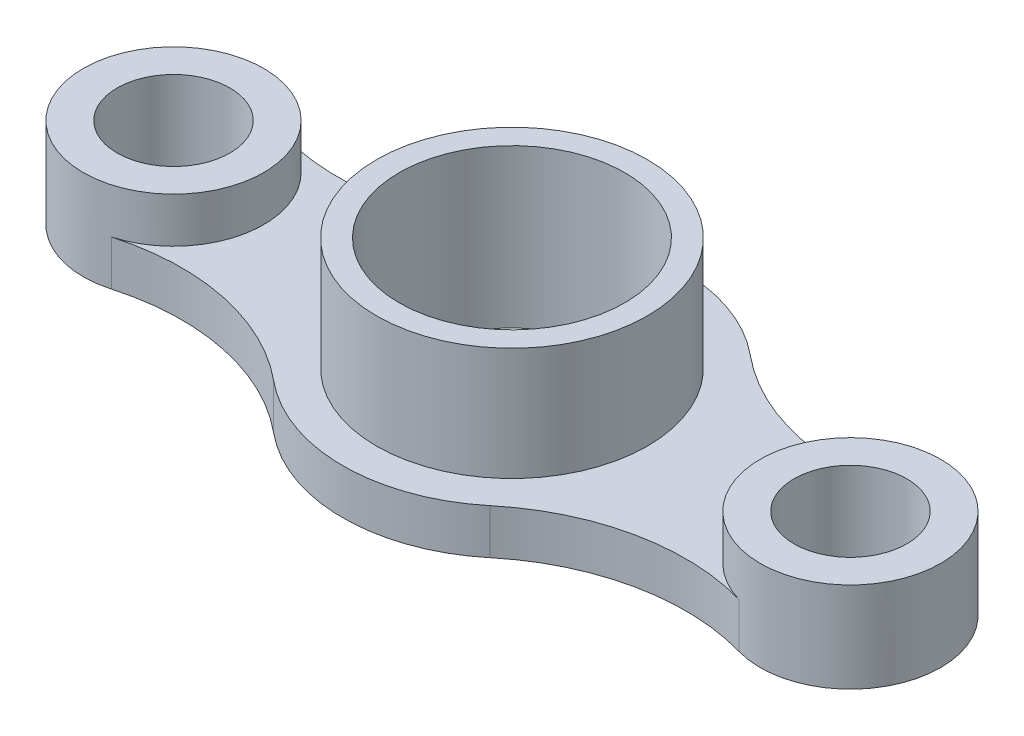
ISO-10303-21;
HEADER;
FILE_DESCRIPTION(('STEP AP214'),'2;1');
FILE_NAME('part.step','',(''),(''),'','','');
FILE_SCHEMA(('AUTOMOTIVE_DESIGN { 1 0 10303 214 1 1 1 1 }'));
ENDSEC;
DATA;
#1=APPLICATION_CONTEXT('core data for automotive mechanical design processes');
#2=APPLICATION_PROTOCOL_DEFINITION('international standard','automotive_design',2000,#1);
#3=PRODUCT_CONTEXT('',#1,'mechanical');
#4=PRODUCT('Part','Part','',(#3));
#5=PRODUCT_RELATED_PRODUCT_CATEGORY('part','',(#4));
#6=PRODUCT_DEFINITION_FORMATION('','',#4);
#7=PRODUCT_DEFINITION_CONTEXT('part definition',#1,'design');
#8=PRODUCT_DEFINITION('design','',#6,#7);
#9=PRODUCT_DEFINITION_SHAPE('','',#8);
#10=(LENGTH_UNIT() NAMED_UNIT(*) SI_UNIT(.MILLI.,.METRE.));
#11=(NAMED_UNIT(*) PLANE_ANGLE_UNIT() SI_UNIT($,.RADIAN.));
#12=(NAMED_UNIT(*) SI_UNIT($,.STERADIAN.) SOLID_ANGLE_UNIT());
#13=UNCERTAINTY_MEASURE_WITH_UNIT(LENGTH_MEASURE(1.E-05),#10,'distance_accuracy_value','');
#14=(GEOMETRIC_REPRESENTATION_CONTEXT(3) GLOBAL_UNCERTAINTY_ASSIGNED_CONTEXT((#13)) GLOBAL_UNIT_ASSIGNED_CONTEXT((#10,
#11,#12)) REPRESENTATION_CONTEXT('',''));
#15=CARTESIAN_POINT('',(0.,0.,0.));
#16=DIRECTION('',(0.,0.,1.));
#17=DIRECTION('',(1.,0.,0.));
#18=AXIS2_PLACEMENT_3D('',#15,#16,#17);
#19=CARTESIAN_POINT('',(-150.,40.,0.));
#20=DIRECTION('',(0.,-1.,0.));
#21=DIRECTION('',(0.,0.,-1.));
#22=AXIS2_PLACEMENT_3D('',#19,#20,#21);
#23=CYLINDRICAL_SURFACE('',#22,40.);
#24=CARTESIAN_POINT('',(-150.,40.,0.));
#25=DIRECTION('',(0.,1.,0.));
#26=DIRECTION('',(0.,0.,1.));
#27=AXIS2_PLACEMENT_3D('',#24,#25,#26);
#28=CIRCLE('',#27,40.);
#29=CARTESIAN_POINT('',(-150.,40.,40.));
#30=VERTEX_POINT('',#29);
#31=EDGE_CURVE('E47',#30,#30,#28,.F.);
#32=ORIENTED_EDGE('',*,*,#31,.T.);
#33=EDGE_LOOP('',(#32));
#34=FACE_BOUND('',#33,.T.);
#35=CARTESIAN_POINT('',(-150.,20.,0.));
#36=DIRECTION('',(0.,1.,0.));
#37=DIRECTION('',(0.,0.,1.));
#38=AXIS2_PLACEMENT_3D('',#35,#36,#37);
#39=CIRCLE('',#38,40.);
#40=CARTESIAN_POINT('',(-139.071428571429,20.,-38.478127897945));
#41=VERTEX_POINT('',#40);
#42=CARTESIAN_POINT('',(-139.071428571428,20.,38.478127897945));
#43=VERTEX_POINT('',#42);
#44=EDGE_CURVE('E133',#41,#43,#39,.F.);
#45=ORIENTED_EDGE('',*,*,#44,.F.);
#46=DIRECTION('',(0.,-1.,0.));
#47=VECTOR('',#46,1.);
#48=CARTESIAN_POINT('',(-139.071428571429,20.,-38.478127897945));
#49=LINE('',#48,#47);
#50=CARTESIAN_POINT('',(-139.071428571429,0.,-38.478127897945));
#51=VERTEX_POINT('',#50);
#52=EDGE_CURVE('E163',#41,#51,#49,.T.);
#53=ORIENTED_EDGE('',*,*,#52,.T.);
#54=CARTESIAN_POINT('',(-150.,0.,0.));
#55=DIRECTION('',(0.,1.,0.));
#56=DIRECTION('',(0.,0.,1.));
#57=AXIS2_PLACEMENT_3D('',#54,#55,#56);
#58=CIRCLE('',#57,40.);
#59=CARTESIAN_POINT('',(-139.071428571429,0.,38.478127897945));
#60=VERTEX_POINT('',#59);
#61=EDGE_CURVE('E170',#60,#51,#58,.F.);
#62=ORIENTED_EDGE('',*,*,#61,.F.);
#63=DIRECTION('',(0.,-1.,0.));
#64=VECTOR('',#63,1.);
#65=CARTESIAN_POINT('',(-139.071428571428,20.,38.478127897945));
#66=LINE('',#65,#64);
#67=EDGE_CURVE('E119',#43,#60,#66,.T.);
#68=ORIENTED_EDGE('',*,*,#67,.F.);
#69=EDGE_LOOP('',(#45,#53,#62,#68));
#70=FACE_BOUND('',#69,.T.);
#71=ADVANCED_FACE('F39',(#34,#70),#23,.T.);
#72=CARTESIAN_POINT('',(-150.,40.,0.));
#73=DIRECTION('',(0.,-1.,0.));
#74=DIRECTION('',(0.,0.,-1.));
#75=AXIS2_PLACEMENT_3D('',#72,#73,#74);
#76=CYLINDRICAL_SURFACE('',#75,25.);
#77=CARTESIAN_POINT('',(-150.,40.,0.));
#78=DIRECTION('',(0.,1.,0.));
#79=DIRECTION('',(0.,0.,1.));
#80=AXIS2_PLACEMENT_3D('',#77,#78,#79);
#81=CIRCLE('',#80,25.);
#82=CARTESIAN_POINT('',(-150.,40.,25.));
#83=VERTEX_POINT('',#82);
#84=EDGE_CURVE('E11',#83,#83,#81,.F.);
#85=ORIENTED_EDGE('',*,*,#84,.F.);
#86=EDGE_LOOP('',(#85));
#87=FACE_BOUND('',#86,.T.);
#88=CARTESIAN_POINT('',(-150.,0.,0.));
#89=DIRECTION('',(0.,1.,0.));
#90=DIRECTION('',(0.,0.,1.));
#91=AXIS2_PLACEMENT_3D('',#88,#89,#90);
#92=CIRCLE('',#91,25.);
#93=CARTESIAN_POINT('',(-150.,0.,25.));
#94=VERTEX_POINT('',#93);
#95=EDGE_CURVE('E42',#94,#94,#92,.F.);
#96=ORIENTED_EDGE('',*,*,#95,.T.);
#97=EDGE_LOOP('',(#96));
#98=FACE_BOUND('',#97,.T.);
#99=ADVANCED_FACE('F176',(#87,#98),#76,.F.);
#100=CARTESIAN_POINT('',(0.,40.,0.));
#101=DIRECTION('',(0.,1.,0.));
#102=DIRECTION('',(0.,0.,1.));
#103=AXIS2_PLACEMENT_3D('',#100,#101,#102);
#104=PLANE('',#103);
#105=ORIENTED_EDGE('',*,*,#31,.F.);
#106=EDGE_LOOP('',(#105));
#107=FACE_BOUND('',#106,.T.);
#108=ORIENTED_EDGE('',*,*,#84,.T.);
#109=EDGE_LOOP('',(#108));
#110=FACE_BOUND('',#109,.T.);
#111=ADVANCED_FACE('F182',(#107,#110),#104,.T.);
#112=CARTESIAN_POINT('',(0.,0.,0.));
#113=DIRECTION('',(0.,1.,0.));
#114=DIRECTION('',(0.,0.,1.));
#115=AXIS2_PLACEMENT_3D('',#112,#113,#114);
#116=PLANE('',#115);
#117=ORIENTED_EDGE('',*,*,#61,.T.);
#118=CARTESIAN_POINT('',(-111.75,0.,-134.673447642807));
#119=DIRECTION('',(0.,1.,0.));
#120=DIRECTION('',(0.,0.,1.));
#121=AXIS2_PLACEMENT_3D('',#118,#119,#120);
#122=CIRCLE('',#121,100.);
#123=CARTESIAN_POINT('',(-47.8928571428571,0.,-57.7171918469175));
#124=VERTEX_POINT('',#123);
#125=EDGE_CURVE('E149',#124,#51,#122,.F.);
#126=ORIENTED_EDGE('',*,*,#125,.F.);
#127=CARTESIAN_POINT('',(0.,0.,0.));
#128=DIRECTION('',(0.,1.,0.));
#129=DIRECTION('',(0.,0.,1.));
#130=AXIS2_PLACEMENT_3D('',#127,#128,#129);
#131=CIRCLE('',#130,75.);
#132=CARTESIAN_POINT('',(47.8928571428571,0.,-57.7171918469175));
#133=VERTEX_POINT('',#132);
#134=EDGE_CURVE('E145',#133,#124,#131,.T.);
#135=ORIENTED_EDGE('',*,*,#134,.F.);
#136=CARTESIAN_POINT('',(111.75,0.,-134.673447642807));
#137=DIRECTION('',(0.,1.,0.));
#138=DIRECTION('',(0.,0.,1.));
#139=AXIS2_PLACEMENT_3D('',#136,#137,#138);
#140=CIRCLE('',#139,100.);
#141=CARTESIAN_POINT('',(139.071428571429,0.,-38.478127897945));
#142=VERTEX_POINT('',#141);
#143=EDGE_CURVE('E143',#133,#142,#140,.T.);
#144=ORIENTED_EDGE('',*,*,#143,.T.);
#145=CARTESIAN_POINT('',(150.,0.,0.));
#146=DIRECTION('',(0.,1.,0.));
#147=DIRECTION('',(0.,0.,1.));
#148=AXIS2_PLACEMENT_3D('',#145,#146,#147);
#149=CIRCLE('',#148,40.);
#150=CARTESIAN_POINT('',(139.071428571429,0.,38.478127897945));
#151=VERTEX_POINT('',#150);
#152=EDGE_CURVE('E202',#151,#142,#149,.T.);
#153=ORIENTED_EDGE('',*,*,#152,.F.);
#154=CARTESIAN_POINT('',(111.75,0.,134.673447642807));
#155=DIRECTION('',(0.,1.,0.));
#156=DIRECTION('',(0.,0.,1.));
#157=AXIS2_PLACEMENT_3D('',#154,#155,#156);
#158=CIRCLE('',#157,100.);
#159=CARTESIAN_POINT('',(47.8928571428571,0.,57.7171918469175));
#160=VERTEX_POINT('',#159);
#161=EDGE_CURVE('E154',#160,#151,#158,.F.);
#162=ORIENTED_EDGE('',*,*,#161,.F.);
#163=CARTESIAN_POINT('',(0.,0.,0.));
#164=DIRECTION('',(0.,1.,0.));
#165=DIRECTION('',(0.,0.,1.));
#166=AXIS2_PLACEMENT_3D('',#163,#164,#165);
#167=CIRCLE('',#166,75.);
#168=CARTESIAN_POINT('',(-47.8928571428571,0.,57.7171918469175));
#169=VERTEX_POINT('',#168);
#170=EDGE_CURVE('E152',#169,#160,#167,.T.);
#171=ORIENTED_EDGE('',*,*,#170,.F.);
#172=CARTESIAN_POINT('',(-111.75,0.,134.673447642807));
#173=DIRECTION('',(0.,1.,0.));
#174=DIRECTION('',(0.,0.,1.));
#175=AXIS2_PLACEMENT_3D('',#172,#173,#174);
#176=CIRCLE('',#175,100.);
#177=EDGE_CURVE('E55',#169,#60,#176,.T.);
#178=ORIENTED_EDGE('',*,*,#177,.T.);
#179=EDGE_LOOP('',(#117,#126,#135,#144,#153,#162,#171,#178));
#180=FACE_BOUND('',#179,.T.);
#181=ORIENTED_EDGE('',*,*,#95,.F.);
#182=EDGE_LOOP('',(#181));
#183=FACE_BOUND('',#182,.T.);
#184=CARTESIAN_POINT('',(150.,0.,0.));
#185=DIRECTION('',(0.,1.,0.));
#186=DIRECTION('',(0.,0.,1.));
#187=AXIS2_PLACEMENT_3D('',#184,#185,#186);
#188=CIRCLE('',#187,25.);
#189=CARTESIAN_POINT('',(150.,0.,25.));
#190=VERTEX_POINT('',#189);
#191=EDGE_CURVE('E187',#190,#190,#188,.T.);
#192=ORIENTED_EDGE('',*,*,#191,.T.);
#193=EDGE_LOOP('',(#192));
#194=FACE_BOUND('',#193,.T.);
#195=CARTESIAN_POINT('',(0.,0.,0.));
#196=DIRECTION('',(0.,1.,0.));
#197=DIRECTION('',(0.,0.,1.));
#198=AXIS2_PLACEMENT_3D('',#195,#196,#197);
#199=CIRCLE('',#198,50.);
#200=CARTESIAN_POINT('',(0.,0.,50.));
#201=VERTEX_POINT('',#200);
#202=EDGE_CURVE('E190',#201,#201,#199,.T.);
#203=ORIENTED_EDGE('',*,*,#202,.T.);
#204=EDGE_LOOP('',(#203));
#205=FACE_BOUND('',#204,.T.);
#206=ADVANCED_FACE('F178',(#180,#183,#194,#205),#116,.F.);
#207=CARTESIAN_POINT('',(111.75,20.,-134.673447642807));
#208=DIRECTION('',(0.,-1.,0.));
#209=DIRECTION('',(0.,0.,-1.));
#210=AXIS2_PLACEMENT_3D('',#207,#208,#209);
#211=CYLINDRICAL_SURFACE('',#210,100.);
#212=ORIENTED_EDGE('',*,*,#143,.F.);
#213=DIRECTION('',(0.,-1.,0.));
#214=VECTOR('',#213,1.);
#215=CARTESIAN_POINT('',(47.8928571428571,20.,-57.7171918469175));
#216=LINE('',#215,#214);
#217=CARTESIAN_POINT('',(47.8928571428571,20.,-57.7171918469175));
#218=VERTEX_POINT('',#217);
#219=EDGE_CURVE('E97',#218,#133,#216,.T.);
#220=ORIENTED_EDGE('',*,*,#219,.F.);
#221=CARTESIAN_POINT('',(111.75,20.,-134.673447642807));
#222=DIRECTION('',(0.,1.,0.));
#223=DIRECTION('',(0.,0.,1.));
#224=AXIS2_PLACEMENT_3D('',#221,#222,#223);
#225=CIRCLE('',#224,100.);
#226=CARTESIAN_POINT('',(139.071428571429,20.,-38.478127897945));
#227=VERTEX_POINT('',#226);
#228=EDGE_CURVE('E64',#218,#227,#225,.T.);
#229=ORIENTED_EDGE('',*,*,#228,.T.);
#230=DIRECTION('',(0.,-1.,0.));
#231=VECTOR('',#230,1.);
#232=CARTESIAN_POINT('',(139.071428571429,20.,-38.478127897945));
#233=LINE('',#232,#231);
#234=EDGE_CURVE('E93',#227,#142,#233,.T.);
#235=ORIENTED_EDGE('',*,*,#234,.T.);
#236=EDGE_LOOP('',(#212,#220,#229,#235));
#237=FACE_BOUND('',#236,.T.);
#238=ADVANCED_FACE('F181',(#237),#211,.F.);
#239=CARTESIAN_POINT('',(0.,20.,0.));
#240=DIRECTION('',(0.,-1.,0.));
#241=DIRECTION('',(0.,0.,-1.));
#242=AXIS2_PLACEMENT_3D('',#239,#240,#241);
#243=CYLINDRICAL_SURFACE('',#242,75.);
#244=ORIENTED_EDGE('',*,*,#134,.T.);
#245=DIRECTION('',(0.,-1.,0.));
#246=VECTOR('',#245,1.);
#247=CARTESIAN_POINT('',(-47.8928571428571,20.,-57.7171918469175));
#248=LINE('',#247,#246);
#249=CARTESIAN_POINT('',(-47.8928571428571,20.,-57.7171918469175));
#250=VERTEX_POINT('',#249);
#251=EDGE_CURVE('E166',#250,#124,#248,.T.);
#252=ORIENTED_EDGE('',*,*,#251,.F.);
#253=CARTESIAN_POINT('',(0.,20.,0.));
#254=DIRECTION('',(0.,1.,0.));
#255=DIRECTION('',(0.,0.,1.));
#256=AXIS2_PLACEMENT_3D('',#253,#254,#255);
#257=CIRCLE('',#256,75.);
#258=EDGE_CURVE('E211',#218,#250,#257,.T.);
#259=ORIENTED_EDGE('',*,*,#258,.F.);
#260=ORIENTED_EDGE('',*,*,#219,.T.);
#261=EDGE_LOOP('',(#244,#252,#259,#260));
#262=FACE_BOUND('',#261,.T.);
#263=ADVANCED_FACE('F235',(#262),#243,.T.);
#264=CARTESIAN_POINT('',(-111.75,20.,-134.673447642807));
#265=DIRECTION('',(0.,-1.,0.));
#266=DIRECTION('',(0.,0.,-1.));
#267=AXIS2_PLACEMENT_3D('',#264,#265,#266);
#268=CYLINDRICAL_SURFACE('',#267,100.);
#269=ORIENTED_EDGE('',*,*,#125,.T.);
#270=ORIENTED_EDGE('',*,*,#52,.F.);
#271=CARTESIAN_POINT('',(-111.75,20.,-134.673447642807));
#272=DIRECTION('',(0.,1.,0.));
#273=DIRECTION('',(0.,0.,1.));
#274=AXIS2_PLACEMENT_3D('',#271,#272,#273);
#275=CIRCLE('',#274,100.);
#276=EDGE_CURVE('E135',#250,#41,#275,.F.);
#277=ORIENTED_EDGE('',*,*,#276,.F.);
#278=ORIENTED_EDGE('',*,*,#251,.T.);
#279=EDGE_LOOP('',(#269,#270,#277,#278));
#280=FACE_BOUND('',#279,.T.);
#281=ADVANCED_FACE('F216',(#280),#268,.F.);
#282=CARTESIAN_POINT('',(-111.75,20.,134.673447642807));
#283=DIRECTION('',(0.,-1.,0.));
#284=DIRECTION('',(0.,0.,-1.));
#285=AXIS2_PLACEMENT_3D('',#282,#283,#284);
#286=CYLINDRICAL_SURFACE('',#285,100.);
#287=ORIENTED_EDGE('',*,*,#177,.F.);
#288=DIRECTION('',(0.,-1.,0.));
#289=VECTOR('',#288,1.);
#290=CARTESIAN_POINT('',(-47.8928571428571,20.,57.7171918469175));
#291=LINE('',#290,#289);
#292=CARTESIAN_POINT('',(-47.8928571428571,20.,57.7171918469175));
#293=VERTEX_POINT('',#292);
#294=EDGE_CURVE('E111',#293,#169,#291,.T.);
#295=ORIENTED_EDGE('',*,*,#294,.F.);
#296=CARTESIAN_POINT('',(-111.75,20.,134.673447642807));
#297=DIRECTION('',(0.,1.,0.));
#298=DIRECTION('',(0.,0.,1.));
#299=AXIS2_PLACEMENT_3D('',#296,#297,#298);
#300=CIRCLE('',#299,100.);
#301=EDGE_CURVE('E115',#293,#43,#300,.T.);
#302=ORIENTED_EDGE('',*,*,#301,.T.);
#303=ORIENTED_EDGE('',*,*,#67,.T.);
#304=EDGE_LOOP('',(#287,#295,#302,#303));
#305=FACE_BOUND('',#304,.T.);
#306=ADVANCED_FACE('F113',(#305),#286,.F.);
#307=CARTESIAN_POINT('',(0.,20.,0.));
#308=DIRECTION('',(0.,-1.,0.));
#309=DIRECTION('',(0.,0.,-1.));
#310=AXIS2_PLACEMENT_3D('',#307,#308,#309);
#311=CYLINDRICAL_SURFACE('',#310,75.);
#312=ORIENTED_EDGE('',*,*,#170,.T.);
#313=DIRECTION('',(0.,-1.,0.));
#314=VECTOR('',#313,1.);
#315=CARTESIAN_POINT('',(47.8928571428571,20.,57.7171918469175));
#316=LINE('',#315,#314);
#317=CARTESIAN_POINT('',(47.8928571428571,20.,57.7171918469175));
#318=VERTEX_POINT('',#317);
#319=EDGE_CURVE('E120',#318,#160,#316,.T.);
#320=ORIENTED_EDGE('',*,*,#319,.F.);
#321=CARTESIAN_POINT('',(0.,20.,0.));
#322=DIRECTION('',(0.,1.,0.));
#323=DIRECTION('',(0.,0.,1.));
#324=AXIS2_PLACEMENT_3D('',#321,#322,#323);
#325=CIRCLE('',#324,75.);
#326=EDGE_CURVE('E124',#293,#318,#325,.T.);
#327=ORIENTED_EDGE('',*,*,#326,.F.);
#328=ORIENTED_EDGE('',*,*,#294,.T.);
#329=EDGE_LOOP('',(#312,#320,#327,#328));
#330=FACE_BOUND('',#329,.T.);
#331=ADVANCED_FACE('F125',(#330),#311,.T.);
#332=CARTESIAN_POINT('',(111.75,20.,134.673447642807));
#333=DIRECTION('',(0.,-1.,0.));
#334=DIRECTION('',(0.,0.,-1.));
#335=AXIS2_PLACEMENT_3D('',#332,#333,#334);
#336=CYLINDRICAL_SURFACE('',#335,100.);
#337=ORIENTED_EDGE('',*,*,#161,.T.);
#338=DIRECTION('',(0.,-1.,0.));
#339=VECTOR('',#338,1.);
#340=CARTESIAN_POINT('',(139.071428571429,20.,38.478127897945));
#341=LINE('',#340,#339);
#342=CARTESIAN_POINT('',(139.071428571429,20.,38.478127897945));
#343=VERTEX_POINT('',#342);
#344=EDGE_CURVE('E158',#343,#151,#341,.T.);
#345=ORIENTED_EDGE('',*,*,#344,.F.);
#346=CARTESIAN_POINT('',(111.75,20.,134.673447642807));
#347=DIRECTION('',(0.,1.,0.));
#348=DIRECTION('',(0.,0.,1.));
#349=AXIS2_PLACEMENT_3D('',#346,#347,#348);
#350=CIRCLE('',#349,100.);
#351=EDGE_CURVE('E129',#318,#343,#350,.F.);
#352=ORIENTED_EDGE('',*,*,#351,.F.);
#353=ORIENTED_EDGE('',*,*,#319,.T.);
#354=EDGE_LOOP('',(#337,#345,#352,#353));
#355=FACE_BOUND('',#354,.T.);
#356=ADVANCED_FACE('F245',(#355),#336,.F.);
#357=CARTESIAN_POINT('',(0.,20.,0.));
#358=DIRECTION('',(0.,1.,0.));
#359=DIRECTION('',(0.,0.,1.));
#360=AXIS2_PLACEMENT_3D('',#357,#358,#359);
#361=PLANE('',#360);
#362=CARTESIAN_POINT('',(0.,20.,0.));
#363=DIRECTION('',(0.,1.,0.));
#364=DIRECTION('',(0.,0.,1.));
#365=AXIS2_PLACEMENT_3D('',#362,#363,#364);
#366=CIRCLE('',#365,60.);
#367=CARTESIAN_POINT('',(0.,20.,60.));
#368=VERTEX_POINT('',#367);
#369=EDGE_CURVE('E156',#368,#368,#366,.T.);
#370=ORIENTED_EDGE('',*,*,#369,.F.);
#371=EDGE_LOOP('',(#370));
#372=FACE_BOUND('',#371,.T.);
#373=ORIENTED_EDGE('',*,*,#228,.F.);
#374=ORIENTED_EDGE('',*,*,#258,.T.);
#375=ORIENTED_EDGE('',*,*,#276,.T.);
#376=ORIENTED_EDGE('',*,*,#44,.T.);
#377=ORIENTED_EDGE('',*,*,#301,.F.);
#378=ORIENTED_EDGE('',*,*,#326,.T.);
#379=ORIENTED_EDGE('',*,*,#351,.T.);
#380=CARTESIAN_POINT('',(150.,20.,0.));
#381=DIRECTION('',(0.,1.,0.));
#382=DIRECTION('',(0.,0.,1.));
#383=AXIS2_PLACEMENT_3D('',#380,#381,#382);
#384=CIRCLE('',#383,40.);
#385=EDGE_CURVE('E140',#227,#343,#384,.T.);
#386=ORIENTED_EDGE('',*,*,#385,.F.);
#387=EDGE_LOOP('',(#373,#374,#375,#376,#377,#378,#379,#386));
#388=FACE_BOUND('',#387,.T.);
#389=ADVANCED_FACE('F131',(#372,#388),#361,.T.);
#390=CARTESIAN_POINT('',(150.,40.,0.));
#391=DIRECTION('',(0.,-1.,0.));
#392=DIRECTION('',(0.,0.,-1.));
#393=AXIS2_PLACEMENT_3D('',#390,#391,#392);
#394=CYLINDRICAL_SURFACE('',#393,25.);
#395=CARTESIAN_POINT('',(150.,40.,0.));
#396=DIRECTION('',(0.,1.,0.));
#397=DIRECTION('',(0.,0.,1.));
#398=AXIS2_PLACEMENT_3D('',#395,#396,#397);
#399=CIRCLE('',#398,25.);
#400=CARTESIAN_POINT('',(150.,40.,25.));
#401=VERTEX_POINT('',#400);
#402=EDGE_CURVE('E199',#401,#401,#399,.T.);
#403=ORIENTED_EDGE('',*,*,#402,.T.);
#404=EDGE_LOOP('',(#403));
#405=FACE_BOUND('',#404,.T.);
#406=ORIENTED_EDGE('',*,*,#191,.F.);
#407=EDGE_LOOP('',(#406));
#408=FACE_BOUND('',#407,.T.);
#409=ADVANCED_FACE('F251',(#405,#408),#394,.F.);
#410=CARTESIAN_POINT('',(150.,40.,0.));
#411=DIRECTION('',(0.,-1.,0.));
#412=DIRECTION('',(0.,0.,-1.));
#413=AXIS2_PLACEMENT_3D('',#410,#411,#412);
#414=CYLINDRICAL_SURFACE('',#413,40.);
#415=ORIENTED_EDGE('',*,*,#234,.F.);
#416=ORIENTED_EDGE('',*,*,#385,.T.);
#417=ORIENTED_EDGE('',*,*,#344,.T.);
#418=ORIENTED_EDGE('',*,*,#152,.T.);
#419=EDGE_LOOP('',(#415,#416,#417,#418));
#420=FACE_BOUND('',#419,.T.);
#421=CARTESIAN_POINT('',(150.,40.,0.));
#422=DIRECTION('',(0.,1.,0.));
#423=DIRECTION('',(0.,0.,1.));
#424=AXIS2_PLACEMENT_3D('',#421,#422,#423);
#425=CIRCLE('',#424,40.);
#426=CARTESIAN_POINT('',(150.,40.,40.));
#427=VERTEX_POINT('',#426);
#428=EDGE_CURVE('E146',#427,#427,#425,.T.);
#429=ORIENTED_EDGE('',*,*,#428,.F.);
#430=EDGE_LOOP('',(#429));
#431=FACE_BOUND('',#430,.T.);
#432=ADVANCED_FACE('F255',(#420,#431),#414,.T.);
#433=CARTESIAN_POINT('',(0.,40.,0.));
#434=DIRECTION('',(0.,1.,0.));
#435=DIRECTION('',(0.,0.,1.));
#436=AXIS2_PLACEMENT_3D('',#433,#434,#435);
#437=PLANE('',#436);
#438=ORIENTED_EDGE('',*,*,#402,.F.);
#439=EDGE_LOOP('',(#438));
#440=FACE_BOUND('',#439,.T.);
#441=ORIENTED_EDGE('',*,*,#428,.T.);
#442=EDGE_LOOP('',(#441));
#443=FACE_BOUND('',#442,.T.);
#444=ADVANCED_FACE('F259',(#440,#443),#437,.T.);
#445=CARTESIAN_POINT('',(0.,70.,0.));
#446=DIRECTION('',(0.,-1.,0.));
#447=DIRECTION('',(0.,0.,-1.));
#448=AXIS2_PLACEMENT_3D('',#445,#446,#447);
#449=CYLINDRICAL_SURFACE('',#448,50.);
#450=CARTESIAN_POINT('',(0.,70.,0.));
#451=DIRECTION('',(0.,1.,0.));
#452=DIRECTION('',(0.,0.,1.));
#453=AXIS2_PLACEMENT_3D('',#450,#451,#452);
#454=CIRCLE('',#453,50.);
#455=CARTESIAN_POINT('',(0.,70.,50.));
#456=VERTEX_POINT('',#455);
#457=EDGE_CURVE('E192',#456,#456,#454,.T.);
#458=ORIENTED_EDGE('',*,*,#457,.T.);
#459=EDGE_LOOP('',(#458));
#460=FACE_BOUND('',#459,.T.);
#461=ORIENTED_EDGE('',*,*,#202,.F.);
#462=EDGE_LOOP('',(#461));
#463=FACE_BOUND('',#462,.T.);
#464=ADVANCED_FACE('F263',(#460,#463),#449,.F.);
#465=CARTESIAN_POINT('',(0.,70.,0.));
#466=DIRECTION('',(0.,-1.,0.));
#467=DIRECTION('',(0.,0.,-1.));
#468=AXIS2_PLACEMENT_3D('',#465,#466,#467);
#469=CYLINDRICAL_SURFACE('',#468,60.);
#470=ORIENTED_EDGE('',*,*,#369,.T.);
#471=EDGE_LOOP('',(#470));
#472=FACE_BOUND('',#471,.T.);
#473=CARTESIAN_POINT('',(0.,70.,0.));
#474=DIRECTION('',(0.,1.,0.));
#475=DIRECTION('',(0.,0.,1.));
#476=AXIS2_PLACEMENT_3D('',#473,#474,#475);
#477=CIRCLE('',#476,60.);
#478=CARTESIAN_POINT('',(0.,70.,60.));
#479=VERTEX_POINT('',#478);
#480=EDGE_CURVE('E195',#479,#479,#477,.T.);
#481=ORIENTED_EDGE('',*,*,#480,.F.);
#482=EDGE_LOOP('',(#481));
#483=FACE_BOUND('',#482,.T.);
#484=ADVANCED_FACE('F267',(#472,#483),#469,.T.);
#485=CARTESIAN_POINT('',(0.,70.,0.));
#486=DIRECTION('',(0.,1.,0.));
#487=DIRECTION('',(0.,0.,1.));
#488=AXIS2_PLACEMENT_3D('',#485,#486,#487);
#489=PLANE('',#488);
#490=ORIENTED_EDGE('',*,*,#457,.F.);
#491=EDGE_LOOP('',(#490));
#492=FACE_BOUND('',#491,.T.);
#493=ORIENTED_EDGE('',*,*,#480,.T.);
#494=EDGE_LOOP('',(#493));
#495=FACE_BOUND('',#494,.T.);
#496=ADVANCED_FACE('F271',(#492,#495),#489,.T.);
#497=CLOSED_SHELL('',(#71,#99,#111,#206,#238,#263,#281,#306,#331,#356,#389,#409,#432,#444,#464,
#484,#496));
#498=MANIFOLD_SOLID_BREP('B2',#497);
#499=ADVANCED_BREP_SHAPE_REPRESENTATION('',(#18,#498),#14);
#500=SHAPE_DEFINITION_REPRESENTATION(#9,#499);
ENDSEC;
END-ISO-10303-21;
